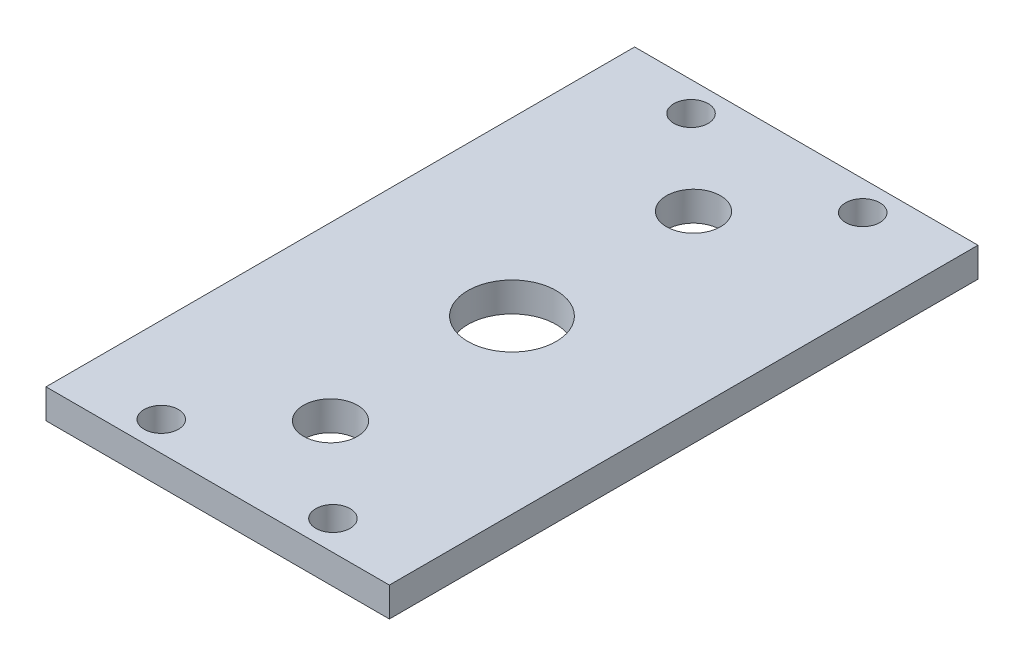
ISO-10303-21;
HEADER;
FILE_DESCRIPTION(('STEP AP214'),'2;1');
FILE_NAME('part.step','',(''),(''),'','','');
FILE_SCHEMA(('AUTOMOTIVE_DESIGN { 1 0 10303 214 1 1 1 1 }'));
ENDSEC;
DATA;
#1=APPLICATION_CONTEXT('core data for automotive mechanical design processes');
#2=APPLICATION_PROTOCOL_DEFINITION('international standard','automotive_design',2000,#1);
#3=PRODUCT_CONTEXT('',#1,'mechanical');
#4=PRODUCT('Part','Part','',(#3));
#5=PRODUCT_RELATED_PRODUCT_CATEGORY('part','',(#4));
#6=PRODUCT_DEFINITION_FORMATION('','',#4);
#7=PRODUCT_DEFINITION_CONTEXT('part definition',#1,'design');
#8=PRODUCT_DEFINITION('design','',#6,#7);
#9=PRODUCT_DEFINITION_SHAPE('','',#8);
#10=(LENGTH_UNIT() NAMED_UNIT(*) SI_UNIT(.MILLI.,.METRE.));
#11=(NAMED_UNIT(*) PLANE_ANGLE_UNIT() SI_UNIT($,.RADIAN.));
#12=(NAMED_UNIT(*) SI_UNIT($,.STERADIAN.) SOLID_ANGLE_UNIT());
#13=UNCERTAINTY_MEASURE_WITH_UNIT(LENGTH_MEASURE(1.E-05),#10,'distance_accuracy_value','');
#14=(GEOMETRIC_REPRESENTATION_CONTEXT(3) GLOBAL_UNCERTAINTY_ASSIGNED_CONTEXT((#13)) GLOBAL_UNIT_ASSIGNED_CONTEXT((#10,
#11,#12)) REPRESENTATION_CONTEXT('',''));
#15=CARTESIAN_POINT('',(0.,0.,0.));
#16=DIRECTION('',(0.,0.,1.));
#17=DIRECTION('',(1.,0.,0.));
#18=AXIS2_PLACEMENT_3D('',#15,#16,#17);
#19=CARTESIAN_POINT('',(0.,3.,0.));
#20=DIRECTION('',(0.,-1.,0.));
#21=DIRECTION('',(0.,0.,-1.));
#22=AXIS2_PLACEMENT_3D('',#19,#20,#21);
#23=PLANE('',#22);
#24=CARTESIAN_POINT('',(0.,3.,0.));
#25=DIRECTION('',(0.,1.,0.));
#26=DIRECTION('',(0.,0.,1.));
#27=AXIS2_PLACEMENT_3D('',#24,#25,#26);
#28=CIRCLE('',#27,4.5);
#29=CARTESIAN_POINT('',(0.,3.,4.5));
#30=VERTEX_POINT('',#29);
#31=EDGE_CURVE('E153',#30,#30,#28,.T.);
#32=ORIENTED_EDGE('',*,*,#31,.F.);
#33=EDGE_LOOP('',(#32));
#34=FACE_BOUND('',#33,.T.);
#35=CARTESIAN_POINT('',(8.75000000000001,3.,-27.));
#36=DIRECTION('',(0.,1.,0.));
#37=DIRECTION('',(0.,0.,1.));
#38=AXIS2_PLACEMENT_3D('',#35,#36,#37);
#39=CIRCLE('',#38,1.75000000000001);
#40=CARTESIAN_POINT('',(8.75000000000001,3.,-25.25));
#41=VERTEX_POINT('',#40);
#42=EDGE_CURVE('E131',#41,#41,#39,.T.);
#43=ORIENTED_EDGE('',*,*,#42,.F.);
#44=EDGE_LOOP('',(#43));
#45=FACE_BOUND('',#44,.T.);
#46=CARTESIAN_POINT('',(8.75000000000001,3.,27.));
#47=DIRECTION('',(0.,1.,0.));
#48=DIRECTION('',(0.,0.,1.));
#49=AXIS2_PLACEMENT_3D('',#46,#47,#48);
#50=CIRCLE('',#49,1.75000000000001);
#51=CARTESIAN_POINT('',(8.75000000000001,3.,28.75));
#52=VERTEX_POINT('',#51);
#53=EDGE_CURVE('E125',#52,#52,#50,.T.);
#54=ORIENTED_EDGE('',*,*,#53,.F.);
#55=EDGE_LOOP('',(#54));
#56=FACE_BOUND('',#55,.T.);
#57=DIRECTION('',(0.,0.,-1.));
#58=VECTOR('',#57,1.);
#59=CARTESIAN_POINT('',(17.5,3.,30.));
#60=LINE('',#59,#58);
#61=CARTESIAN_POINT('',(17.5,3.,30.));
#62=VERTEX_POINT('',#61);
#63=CARTESIAN_POINT('',(17.5,3.,-30.));
#64=VERTEX_POINT('',#63);
#65=EDGE_CURVE('E91',#62,#64,#60,.T.);
#66=ORIENTED_EDGE('',*,*,#65,.T.);
#67=DIRECTION('',(-1.,0.,0.));
#68=VECTOR('',#67,1.);
#69=CARTESIAN_POINT('',(-17.5,3.,-30.));
#70=LINE('',#69,#68);
#71=CARTESIAN_POINT('',(-17.5,3.,-30.));
#72=VERTEX_POINT('',#71);
#73=EDGE_CURVE('E86',#64,#72,#70,.T.);
#74=ORIENTED_EDGE('',*,*,#73,.T.);
#75=DIRECTION('',(0.,0.,1.));
#76=VECTOR('',#75,1.);
#77=CARTESIAN_POINT('',(-17.5,3.,30.));
#78=LINE('',#77,#76);
#79=CARTESIAN_POINT('',(-17.5,3.,30.));
#80=VERTEX_POINT('',#79);
#81=EDGE_CURVE('E89',#72,#80,#78,.T.);
#82=ORIENTED_EDGE('',*,*,#81,.T.);
#83=DIRECTION('',(1.,0.,0.));
#84=VECTOR('',#83,1.);
#85=CARTESIAN_POINT('',(-17.5,3.,30.));
#86=LINE('',#85,#84);
#87=EDGE_CURVE('E56',#80,#62,#86,.T.);
#88=ORIENTED_EDGE('',*,*,#87,.T.);
#89=EDGE_LOOP('',(#66,#74,#82,#88));
#90=FACE_BOUND('',#89,.T.);
#91=CARTESIAN_POINT('',(-8.74999999999999,3.,27.));
#92=DIRECTION('',(0.,1.,0.));
#93=DIRECTION('',(0.,0.,1.));
#94=AXIS2_PLACEMENT_3D('',#91,#92,#93);
#95=CIRCLE('',#94,1.75000000000001);
#96=CARTESIAN_POINT('',(-8.74999999999999,3.,28.75));
#97=VERTEX_POINT('',#96);
#98=EDGE_CURVE('E119',#97,#97,#95,.T.);
#99=ORIENTED_EDGE('',*,*,#98,.F.);
#100=EDGE_LOOP('',(#99));
#101=FACE_BOUND('',#100,.T.);
#102=CARTESIAN_POINT('',(-8.74999999999999,3.,-27.));
#103=DIRECTION('',(0.,1.,0.));
#104=DIRECTION('',(0.,0.,1.));
#105=AXIS2_PLACEMENT_3D('',#102,#103,#104);
#106=CIRCLE('',#105,1.75000000000001);
#107=CARTESIAN_POINT('',(-8.74999999999999,3.,-25.25));
#108=VERTEX_POINT('',#107);
#109=EDGE_CURVE('E137',#108,#108,#106,.T.);
#110=ORIENTED_EDGE('',*,*,#109,.F.);
#111=EDGE_LOOP('',(#110));
#112=FACE_BOUND('',#111,.T.);
#113=CARTESIAN_POINT('',(0.,3.,18.5));
#114=DIRECTION('',(0.,1.,0.));
#115=DIRECTION('',(0.,0.,1.));
#116=AXIS2_PLACEMENT_3D('',#113,#114,#115);
#117=CIRCLE('',#116,2.75000000000001);
#118=CARTESIAN_POINT('',(0.,3.,21.25));
#119=VERTEX_POINT('',#118);
#120=EDGE_CURVE('E143',#119,#119,#117,.T.);
#121=ORIENTED_EDGE('',*,*,#120,.F.);
#122=EDGE_LOOP('',(#121));
#123=FACE_BOUND('',#122,.T.);
#124=CARTESIAN_POINT('',(0.,3.,-18.5));
#125=DIRECTION('',(0.,1.,0.));
#126=DIRECTION('',(0.,0.,1.));
#127=AXIS2_PLACEMENT_3D('',#124,#125,#126);
#128=CIRCLE('',#127,2.75000000000001);
#129=CARTESIAN_POINT('',(0.,3.,-15.75));
#130=VERTEX_POINT('',#129);
#131=EDGE_CURVE('E149',#130,#130,#128,.T.);
#132=ORIENTED_EDGE('',*,*,#131,.F.);
#133=EDGE_LOOP('',(#132));
#134=FACE_BOUND('',#133,.T.);
#135=ADVANCED_FACE('F39',(#34,#45,#56,#90,#101,#112,#123,#134),#23,.F.);
#136=CARTESIAN_POINT('',(17.5,3.,30.));
#137=DIRECTION('',(-1.,0.,0.));
#138=DIRECTION('',(0.,0.,1.));
#139=AXIS2_PLACEMENT_3D('',#136,#137,#138);
#140=PLANE('',#139);
#141=DIRECTION('',(0.,0.,-1.));
#142=VECTOR('',#141,1.);
#143=CARTESIAN_POINT('',(17.5,0.,30.));
#144=LINE('',#143,#142);
#145=CARTESIAN_POINT('',(17.5,0.,30.));
#146=VERTEX_POINT('',#145);
#147=CARTESIAN_POINT('',(17.5,0.,-30.));
#148=VERTEX_POINT('',#147);
#149=EDGE_CURVE('E103',#146,#148,#144,.T.);
#150=ORIENTED_EDGE('',*,*,#149,.T.);
#151=DIRECTION('',(0.,-1.,0.));
#152=VECTOR('',#151,1.);
#153=CARTESIAN_POINT('',(17.5,3.,-30.));
#154=LINE('',#153,#152);
#155=EDGE_CURVE('E11',#64,#148,#154,.T.);
#156=ORIENTED_EDGE('',*,*,#155,.F.);
#157=ORIENTED_EDGE('',*,*,#65,.F.);
#158=DIRECTION('',(0.,-1.,0.));
#159=VECTOR('',#158,1.);
#160=CARTESIAN_POINT('',(17.5,3.,30.));
#161=LINE('',#160,#159);
#162=EDGE_CURVE('E99',#62,#146,#161,.T.);
#163=ORIENTED_EDGE('',*,*,#162,.T.);
#164=EDGE_LOOP('',(#150,#156,#157,#163));
#165=FACE_BOUND('',#164,.T.);
#166=ADVANCED_FACE('F41',(#165),#140,.F.);
#167=CARTESIAN_POINT('',(-17.5,3.,-30.));
#168=DIRECTION('',(0.,0.,1.));
#169=DIRECTION('',(1.,0.,0.));
#170=AXIS2_PLACEMENT_3D('',#167,#168,#169);
#171=PLANE('',#170);
#172=DIRECTION('',(-1.,0.,0.));
#173=VECTOR('',#172,1.);
#174=CARTESIAN_POINT('',(-17.5,0.,-30.));
#175=LINE('',#174,#173);
#176=CARTESIAN_POINT('',(-17.5,0.,-30.));
#177=VERTEX_POINT('',#176);
#178=EDGE_CURVE('E95',#148,#177,#175,.T.);
#179=ORIENTED_EDGE('',*,*,#178,.T.);
#180=DIRECTION('',(0.,-1.,0.));
#181=VECTOR('',#180,1.);
#182=CARTESIAN_POINT('',(-17.5,3.,-30.));
#183=LINE('',#182,#181);
#184=EDGE_CURVE('E48',#72,#177,#183,.T.);
#185=ORIENTED_EDGE('',*,*,#184,.F.);
#186=ORIENTED_EDGE('',*,*,#73,.F.);
#187=ORIENTED_EDGE('',*,*,#155,.T.);
#188=EDGE_LOOP('',(#179,#185,#186,#187));
#189=FACE_BOUND('',#188,.T.);
#190=ADVANCED_FACE('F94',(#189),#171,.F.);
#191=CARTESIAN_POINT('',(-17.5,3.,30.));
#192=DIRECTION('',(1.,0.,0.));
#193=DIRECTION('',(0.,0.,-1.));
#194=AXIS2_PLACEMENT_3D('',#191,#192,#193);
#195=PLANE('',#194);
#196=DIRECTION('',(0.,0.,1.));
#197=VECTOR('',#196,1.);
#198=CARTESIAN_POINT('',(-17.5,0.,30.));
#199=LINE('',#198,#197);
#200=CARTESIAN_POINT('',(-17.5,0.,30.));
#201=VERTEX_POINT('',#200);
#202=EDGE_CURVE('E73',#177,#201,#199,.T.);
#203=ORIENTED_EDGE('',*,*,#202,.T.);
#204=DIRECTION('',(0.,-1.,0.));
#205=VECTOR('',#204,1.);
#206=CARTESIAN_POINT('',(-17.5,3.,30.));
#207=LINE('',#206,#205);
#208=EDGE_CURVE('E96',#80,#201,#207,.T.);
#209=ORIENTED_EDGE('',*,*,#208,.F.);
#210=ORIENTED_EDGE('',*,*,#81,.F.);
#211=ORIENTED_EDGE('',*,*,#184,.T.);
#212=EDGE_LOOP('',(#203,#209,#210,#211));
#213=FACE_BOUND('',#212,.T.);
#214=ADVANCED_FACE('F97',(#213),#195,.F.);
#215=CARTESIAN_POINT('',(-17.5,3.,30.));
#216=DIRECTION('',(0.,0.,-1.));
#217=DIRECTION('',(-1.,0.,0.));
#218=AXIS2_PLACEMENT_3D('',#215,#216,#217);
#219=PLANE('',#218);
#220=DIRECTION('',(1.,0.,0.));
#221=VECTOR('',#220,1.);
#222=CARTESIAN_POINT('',(-17.5,0.,30.));
#223=LINE('',#222,#221);
#224=EDGE_CURVE('E79',#201,#146,#223,.T.);
#225=ORIENTED_EDGE('',*,*,#224,.T.);
#226=ORIENTED_EDGE('',*,*,#162,.F.);
#227=ORIENTED_EDGE('',*,*,#87,.F.);
#228=ORIENTED_EDGE('',*,*,#208,.T.);
#229=EDGE_LOOP('',(#225,#226,#227,#228));
#230=FACE_BOUND('',#229,.T.);
#231=ADVANCED_FACE('F111',(#230),#219,.F.);
#232=CARTESIAN_POINT('',(0.,0.,0.));
#233=DIRECTION('',(0.,-1.,0.));
#234=DIRECTION('',(0.,0.,-1.));
#235=AXIS2_PLACEMENT_3D('',#232,#233,#234);
#236=PLANE('',#235);
#237=CARTESIAN_POINT('',(0.,0.,0.));
#238=DIRECTION('',(0.,1.,0.));
#239=DIRECTION('',(0.,0.,1.));
#240=AXIS2_PLACEMENT_3D('',#237,#238,#239);
#241=CIRCLE('',#240,4.5);
#242=CARTESIAN_POINT('',(0.,0.,4.5));
#243=VERTEX_POINT('',#242);
#244=EDGE_CURVE('E152',#243,#243,#241,.T.);
#245=ORIENTED_EDGE('',*,*,#244,.T.);
#246=EDGE_LOOP('',(#245));
#247=FACE_BOUND('',#246,.T.);
#248=CARTESIAN_POINT('',(0.,0.,-18.5));
#249=DIRECTION('',(0.,-1.,0.));
#250=DIRECTION('',(0.,0.,-1.));
#251=AXIS2_PLACEMENT_3D('',#248,#249,#250);
#252=CIRCLE('',#251,2.75000000000001);
#253=CARTESIAN_POINT('',(0.,0.,-21.25));
#254=VERTEX_POINT('',#253);
#255=EDGE_CURVE('E146',#254,#254,#252,.T.);
#256=ORIENTED_EDGE('',*,*,#255,.F.);
#257=EDGE_LOOP('',(#256));
#258=FACE_BOUND('',#257,.T.);
#259=CARTESIAN_POINT('',(0.,0.,18.5));
#260=DIRECTION('',(0.,-1.,0.));
#261=DIRECTION('',(0.,0.,-1.));
#262=AXIS2_PLACEMENT_3D('',#259,#260,#261);
#263=CIRCLE('',#262,2.75000000000001);
#264=CARTESIAN_POINT('',(0.,0.,15.75));
#265=VERTEX_POINT('',#264);
#266=EDGE_CURVE('E140',#265,#265,#263,.T.);
#267=ORIENTED_EDGE('',*,*,#266,.F.);
#268=EDGE_LOOP('',(#267));
#269=FACE_BOUND('',#268,.T.);
#270=CARTESIAN_POINT('',(-8.74999999999999,0.,-27.));
#271=DIRECTION('',(0.,-1.,0.));
#272=DIRECTION('',(0.,0.,-1.));
#273=AXIS2_PLACEMENT_3D('',#270,#271,#272);
#274=CIRCLE('',#273,1.75000000000001);
#275=CARTESIAN_POINT('',(-8.74999999999999,0.,-28.75));
#276=VERTEX_POINT('',#275);
#277=EDGE_CURVE('E134',#276,#276,#274,.T.);
#278=ORIENTED_EDGE('',*,*,#277,.F.);
#279=EDGE_LOOP('',(#278));
#280=FACE_BOUND('',#279,.T.);
#281=CARTESIAN_POINT('',(8.75000000000001,0.,-27.));
#282=DIRECTION('',(0.,-1.,0.));
#283=DIRECTION('',(0.,0.,-1.));
#284=AXIS2_PLACEMENT_3D('',#281,#282,#283);
#285=CIRCLE('',#284,1.75000000000001);
#286=CARTESIAN_POINT('',(8.75000000000001,0.,-28.75));
#287=VERTEX_POINT('',#286);
#288=EDGE_CURVE('E128',#287,#287,#285,.T.);
#289=ORIENTED_EDGE('',*,*,#288,.F.);
#290=EDGE_LOOP('',(#289));
#291=FACE_BOUND('',#290,.T.);
#292=CARTESIAN_POINT('',(8.75000000000001,0.,27.));
#293=DIRECTION('',(0.,-1.,0.));
#294=DIRECTION('',(0.,0.,-1.));
#295=AXIS2_PLACEMENT_3D('',#292,#293,#294);
#296=CIRCLE('',#295,1.75000000000001);
#297=CARTESIAN_POINT('',(8.75000000000001,0.,25.25));
#298=VERTEX_POINT('',#297);
#299=EDGE_CURVE('E122',#298,#298,#296,.T.);
#300=ORIENTED_EDGE('',*,*,#299,.F.);
#301=EDGE_LOOP('',(#300));
#302=FACE_BOUND('',#301,.T.);
#303=CARTESIAN_POINT('',(-8.74999999999999,0.,27.));
#304=DIRECTION('',(0.,-1.,0.));
#305=DIRECTION('',(0.,0.,-1.));
#306=AXIS2_PLACEMENT_3D('',#303,#304,#305);
#307=CIRCLE('',#306,1.75000000000001);
#308=CARTESIAN_POINT('',(-8.74999999999999,0.,25.25));
#309=VERTEX_POINT('',#308);
#310=EDGE_CURVE('E106',#309,#309,#307,.T.);
#311=ORIENTED_EDGE('',*,*,#310,.F.);
#312=EDGE_LOOP('',(#311));
#313=FACE_BOUND('',#312,.T.);
#314=ORIENTED_EDGE('',*,*,#149,.F.);
#315=ORIENTED_EDGE('',*,*,#224,.F.);
#316=ORIENTED_EDGE('',*,*,#202,.F.);
#317=ORIENTED_EDGE('',*,*,#178,.F.);
#318=EDGE_LOOP('',(#314,#315,#316,#317));
#319=FACE_BOUND('',#318,.T.);
#320=ADVANCED_FACE('F114',(#247,#258,#269,#280,#291,#302,#313,#319),#236,.T.);
#321=CARTESIAN_POINT('',(-8.74999999999999,3.,27.));
#322=DIRECTION('',(0.,1.,0.));
#323=DIRECTION('',(0.,0.,1.));
#324=AXIS2_PLACEMENT_3D('',#321,#322,#323);
#325=CYLINDRICAL_SURFACE('',#324,1.75000000000001);
#326=ORIENTED_EDGE('',*,*,#98,.T.);
#327=EDGE_LOOP('',(#326));
#328=FACE_BOUND('',#327,.T.);
#329=ORIENTED_EDGE('',*,*,#310,.T.);
#330=EDGE_LOOP('',(#329));
#331=FACE_BOUND('',#330,.T.);
#332=ADVANCED_FACE('F179',(#328,#331),#325,.F.);
#333=CARTESIAN_POINT('',(8.75000000000001,3.,27.));
#334=DIRECTION('',(0.,1.,0.));
#335=DIRECTION('',(0.,0.,1.));
#336=AXIS2_PLACEMENT_3D('',#333,#334,#335);
#337=CYLINDRICAL_SURFACE('',#336,1.75000000000001);
#338=ORIENTED_EDGE('',*,*,#53,.T.);
#339=EDGE_LOOP('',(#338));
#340=FACE_BOUND('',#339,.T.);
#341=ORIENTED_EDGE('',*,*,#299,.T.);
#342=EDGE_LOOP('',(#341));
#343=FACE_BOUND('',#342,.T.);
#344=ADVANCED_FACE('F175',(#340,#343),#337,.F.);
#345=CARTESIAN_POINT('',(8.75000000000001,3.,-27.));
#346=DIRECTION('',(0.,1.,0.));
#347=DIRECTION('',(0.,0.,1.));
#348=AXIS2_PLACEMENT_3D('',#345,#346,#347);
#349=CYLINDRICAL_SURFACE('',#348,1.75000000000001);
#350=ORIENTED_EDGE('',*,*,#42,.T.);
#351=EDGE_LOOP('',(#350));
#352=FACE_BOUND('',#351,.T.);
#353=ORIENTED_EDGE('',*,*,#288,.T.);
#354=EDGE_LOOP('',(#353));
#355=FACE_BOUND('',#354,.T.);
#356=ADVANCED_FACE('F178',(#352,#355),#349,.F.);
#357=CARTESIAN_POINT('',(-8.74999999999999,3.,-27.));
#358=DIRECTION('',(0.,1.,0.));
#359=DIRECTION('',(0.,0.,1.));
#360=AXIS2_PLACEMENT_3D('',#357,#358,#359);
#361=CYLINDRICAL_SURFACE('',#360,1.75000000000001);
#362=ORIENTED_EDGE('',*,*,#109,.T.);
#363=EDGE_LOOP('',(#362));
#364=FACE_BOUND('',#363,.T.);
#365=ORIENTED_EDGE('',*,*,#277,.T.);
#366=EDGE_LOOP('',(#365));
#367=FACE_BOUND('',#366,.T.);
#368=ADVANCED_FACE('F246',(#364,#367),#361,.F.);
#369=CARTESIAN_POINT('',(0.,3.,18.5));
#370=DIRECTION('',(0.,1.,0.));
#371=DIRECTION('',(0.,0.,1.));
#372=AXIS2_PLACEMENT_3D('',#369,#370,#371);
#373=CYLINDRICAL_SURFACE('',#372,2.75000000000001);
#374=ORIENTED_EDGE('',*,*,#120,.T.);
#375=EDGE_LOOP('',(#374));
#376=FACE_BOUND('',#375,.T.);
#377=ORIENTED_EDGE('',*,*,#266,.T.);
#378=EDGE_LOOP('',(#377));
#379=FACE_BOUND('',#378,.T.);
#380=ADVANCED_FACE('F255',(#376,#379),#373,.F.);
#381=CARTESIAN_POINT('',(0.,3.,-18.5));
#382=DIRECTION('',(0.,1.,0.));
#383=DIRECTION('',(0.,0.,1.));
#384=AXIS2_PLACEMENT_3D('',#381,#382,#383);
#385=CYLINDRICAL_SURFACE('',#384,2.75000000000001);
#386=ORIENTED_EDGE('',*,*,#131,.T.);
#387=EDGE_LOOP('',(#386));
#388=FACE_BOUND('',#387,.T.);
#389=ORIENTED_EDGE('',*,*,#255,.T.);
#390=EDGE_LOOP('',(#389));
#391=FACE_BOUND('',#390,.T.);
#392=ADVANCED_FACE('F164',(#388,#391),#385,.F.);
#393=CARTESIAN_POINT('',(0.,0.,0.));
#394=DIRECTION('',(0.,1.,0.));
#395=DIRECTION('',(0.,0.,1.));
#396=AXIS2_PLACEMENT_3D('',#393,#394,#395);
#397=CYLINDRICAL_SURFACE('',#396,4.5);
#398=ORIENTED_EDGE('',*,*,#244,.F.);
#399=EDGE_LOOP('',(#398));
#400=FACE_BOUND('',#399,.T.);
#401=ORIENTED_EDGE('',*,*,#31,.T.);
#402=EDGE_LOOP('',(#401));
#403=FACE_BOUND('',#402,.T.);
#404=ADVANCED_FACE('F161',(#400,#403),#397,.F.);
#405=CLOSED_SHELL('',(#135,#166,#190,#214,#231,#320,#332,#344,#356,#368,#380,#392,#404));
#406=MANIFOLD_SOLID_BREP('B2',#405);
#407=ADVANCED_BREP_SHAPE_REPRESENTATION('',(#18,#406),#14);
#408=SHAPE_DEFINITION_REPRESENTATION(#9,#407);
ENDSEC;
END-ISO-10303-21;
